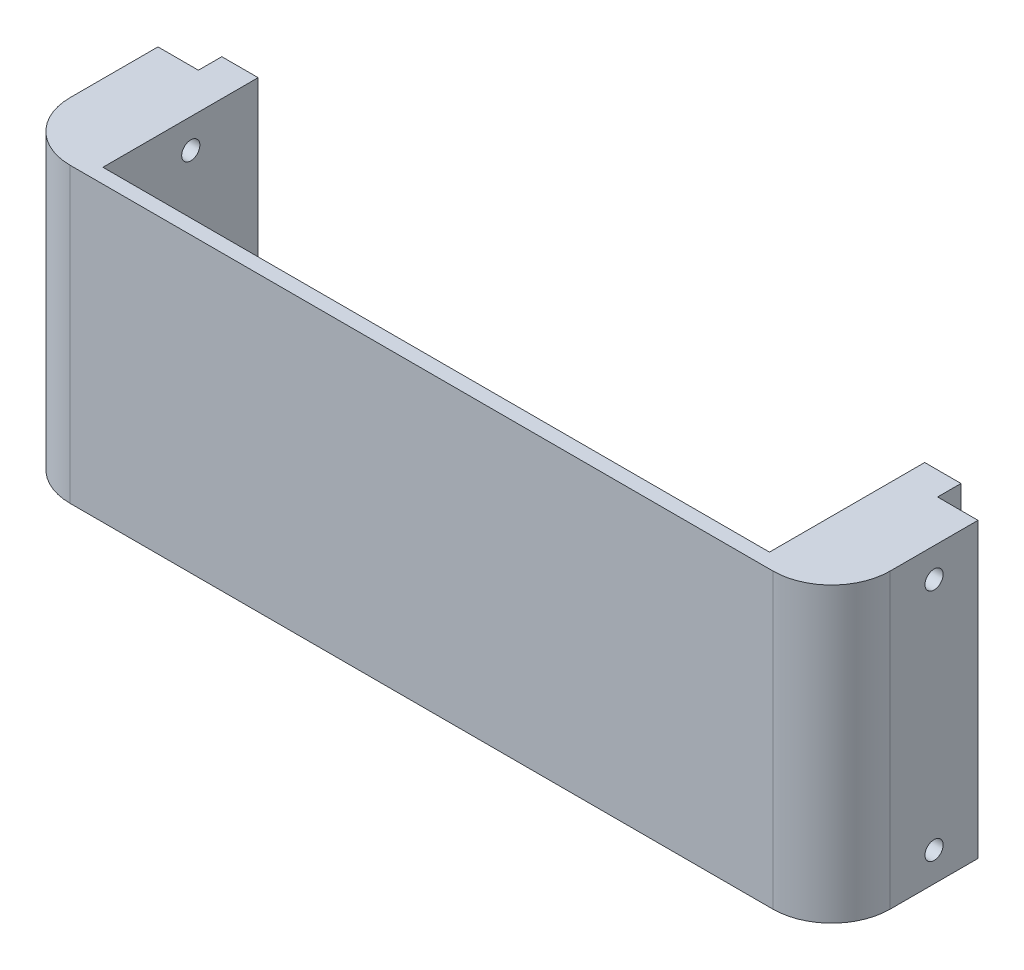
ISO-10303-21;
HEADER;
FILE_DESCRIPTION(('STEP AP214'),'2;1');
FILE_NAME('part.step','',(''),(''),'','','');
FILE_SCHEMA(('AUTOMOTIVE_DESIGN { 1 0 10303 214 1 1 1 1 }'));
ENDSEC;
DATA;
#1=APPLICATION_CONTEXT('core data for automotive mechanical design processes');
#2=APPLICATION_PROTOCOL_DEFINITION('international standard','automotive_design',2000,#1);
#3=PRODUCT_CONTEXT('',#1,'mechanical');
#4=PRODUCT('Part','Part','',(#3));
#5=PRODUCT_RELATED_PRODUCT_CATEGORY('part','',(#4));
#6=PRODUCT_DEFINITION_FORMATION('','',#4);
#7=PRODUCT_DEFINITION_CONTEXT('part definition',#1,'design');
#8=PRODUCT_DEFINITION('design','',#6,#7);
#9=PRODUCT_DEFINITION_SHAPE('','',#8);
#10=(LENGTH_UNIT() NAMED_UNIT(*) SI_UNIT(.MILLI.,.METRE.));
#11=(NAMED_UNIT(*) PLANE_ANGLE_UNIT() SI_UNIT($,.RADIAN.));
#12=(NAMED_UNIT(*) SI_UNIT($,.STERADIAN.) SOLID_ANGLE_UNIT());
#13=UNCERTAINTY_MEASURE_WITH_UNIT(LENGTH_MEASURE(1.E-05),#10,'distance_accuracy_value','');
#14=(GEOMETRIC_REPRESENTATION_CONTEXT(3) GLOBAL_UNCERTAINTY_ASSIGNED_CONTEXT((#13)) GLOBAL_UNIT_ASSIGNED_CONTEXT((#10,
#11,#12)) REPRESENTATION_CONTEXT('',''));
#15=CARTESIAN_POINT('',(0.,0.,0.));
#16=DIRECTION('',(0.,0.,1.));
#17=DIRECTION('',(1.,0.,0.));
#18=AXIS2_PLACEMENT_3D('',#15,#16,#17);
#19=CARTESIAN_POINT('',(0.,22.,14.));
#20=DIRECTION('',(0.,1.,0.));
#21=DIRECTION('',(0.,0.,1.));
#22=AXIS2_PLACEMENT_3D('',#19,#20,#21);
#23=PLANE('',#22);
#24=DIRECTION('',(1.,0.,0.));
#25=VECTOR('',#24,1.);
#26=CARTESIAN_POINT('',(9.99999999999999,22.,26.5));
#27=LINE('',#26,#25);
#28=CARTESIAN_POINT('',(3.1,22.,26.5));
#29=VERTEX_POINT('',#28);
#30=CARTESIAN_POINT('',(116.9,22.,26.5));
#31=VERTEX_POINT('',#30);
#32=EDGE_CURVE('E281',#29,#31,#27,.T.);
#33=ORIENTED_EDGE('',*,*,#32,.F.);
#34=DIRECTION('',(0.,0.,-1.));
#35=VECTOR('',#34,1.);
#36=CARTESIAN_POINT('',(3.1,22.,0.));
#37=LINE('',#36,#35);
#38=CARTESIAN_POINT('',(3.1,22.,0.));
#39=VERTEX_POINT('',#38);
#40=EDGE_CURVE('E306',#29,#39,#37,.T.);
#41=ORIENTED_EDGE('',*,*,#40,.T.);
#42=DIRECTION('',(1.,0.,0.));
#43=VECTOR('',#42,1.);
#44=CARTESIAN_POINT('',(0.,22.,0.));
#45=LINE('',#44,#43);
#46=CARTESIAN_POINT('',(-3.1,22.,0.));
#47=VERTEX_POINT('',#46);
#48=EDGE_CURVE('E12',#47,#39,#45,.T.);
#49=ORIENTED_EDGE('',*,*,#48,.F.);
#50=DIRECTION('',(0.,0.,1.));
#51=VECTOR('',#50,1.);
#52=CARTESIAN_POINT('',(-3.1,22.,0.));
#53=LINE('',#52,#51);
#54=CARTESIAN_POINT('',(-3.1,22.,4.));
#55=VERTEX_POINT('',#54);
#56=EDGE_CURVE('E302',#47,#55,#53,.T.);
#57=ORIENTED_EDGE('',*,*,#56,.T.);
#58=DIRECTION('',(-1.,0.,0.));
#59=VECTOR('',#58,1.);
#60=CARTESIAN_POINT('',(0.,22.,4.));
#61=LINE('',#60,#59);
#62=CARTESIAN_POINT('',(-10.,22.,4.));
#63=VERTEX_POINT('',#62);
#64=EDGE_CURVE('E305',#55,#63,#61,.T.);
#65=ORIENTED_EDGE('',*,*,#64,.T.);
#66=DIRECTION('',(0.,0.,-1.));
#67=VECTOR('',#66,1.);
#68=CARTESIAN_POINT('',(-10.,22.,14.));
#69=LINE('',#68,#67);
#70=CARTESIAN_POINT('',(-10.,22.,19.));
#71=VERTEX_POINT('',#70);
#72=EDGE_CURVE('E300',#71,#63,#69,.T.);
#73=ORIENTED_EDGE('',*,*,#72,.F.);
#74=CARTESIAN_POINT('',(0.,22.,19.));
#75=DIRECTION('',(0.,1.,0.));
#76=DIRECTION('',(-1.,0.,0.));
#77=AXIS2_PLACEMENT_3D('',#74,#75,#76);
#78=CIRCLE('',#77,10.);
#79=CARTESIAN_POINT('',(0.,22.,29.));
#80=VERTEX_POINT('',#79);
#81=EDGE_CURVE('E296',#71,#80,#78,.T.);
#82=ORIENTED_EDGE('',*,*,#81,.T.);
#83=DIRECTION('',(1.,0.,0.));
#84=VECTOR('',#83,1.);
#85=CARTESIAN_POINT('',(-10.,22.,29.));
#86=LINE('',#85,#84);
#87=CARTESIAN_POINT('',(120.,22.,29.));
#88=VERTEX_POINT('',#87);
#89=EDGE_CURVE('E205',#80,#88,#86,.T.);
#90=ORIENTED_EDGE('',*,*,#89,.T.);
#91=CARTESIAN_POINT('',(120.,22.,19.));
#92=DIRECTION('',(0.,-1.,0.));
#93=DIRECTION('',(1.,0.,0.));
#94=AXIS2_PLACEMENT_3D('',#91,#92,#93);
#95=CIRCLE('',#94,10.);
#96=CARTESIAN_POINT('',(130.,22.,19.));
#97=VERTEX_POINT('',#96);
#98=EDGE_CURVE('E262',#97,#88,#95,.T.);
#99=ORIENTED_EDGE('',*,*,#98,.F.);
#100=DIRECTION('',(0.,0.,-1.));
#101=VECTOR('',#100,1.);
#102=CARTESIAN_POINT('',(130.,22.,19.));
#103=LINE('',#102,#101);
#104=CARTESIAN_POINT('',(130.,22.,4.));
#105=VERTEX_POINT('',#104);
#106=EDGE_CURVE('E267',#97,#105,#103,.T.);
#107=ORIENTED_EDGE('',*,*,#106,.T.);
#108=DIRECTION('',(1.,0.,0.));
#109=VECTOR('',#108,1.);
#110=CARTESIAN_POINT('',(123.1,22.,4.));
#111=LINE('',#110,#109);
#112=CARTESIAN_POINT('',(123.1,22.,4.));
#113=VERTEX_POINT('',#112);
#114=EDGE_CURVE('E269',#113,#105,#111,.T.);
#115=ORIENTED_EDGE('',*,*,#114,.F.);
#116=DIRECTION('',(0.,0.,1.));
#117=VECTOR('',#116,1.);
#118=CARTESIAN_POINT('',(123.1,22.,0.));
#119=LINE('',#118,#117);
#120=CARTESIAN_POINT('',(123.1,22.,0.));
#121=VERTEX_POINT('',#120);
#122=EDGE_CURVE('E272',#121,#113,#119,.T.);
#123=ORIENTED_EDGE('',*,*,#122,.F.);
#124=DIRECTION('',(1.,0.,0.));
#125=VECTOR('',#124,1.);
#126=CARTESIAN_POINT('',(120.,22.,0.));
#127=LINE('',#126,#125);
#128=CARTESIAN_POINT('',(116.9,22.,0.));
#129=VERTEX_POINT('',#128);
#130=EDGE_CURVE('E275',#129,#121,#127,.T.);
#131=ORIENTED_EDGE('',*,*,#130,.F.);
#132=DIRECTION('',(0.,0.,-1.));
#133=VECTOR('',#132,1.);
#134=CARTESIAN_POINT('',(116.9,22.,4.));
#135=LINE('',#134,#133);
#136=EDGE_CURVE('E278',#31,#129,#135,.T.);
#137=ORIENTED_EDGE('',*,*,#136,.F.);
#138=EDGE_LOOP('',(#33,#41,#49,#57,#65,#73,#82,#90,#99,#107,#115,#123,#131,#137));
#139=FACE_BOUND('',#138,.T.);
#140=ADVANCED_FACE('F92',(#139),#23,.T.);
#141=CARTESIAN_POINT('',(-10.,22.,29.));
#142=DIRECTION('',(0.,0.,-1.));
#143=DIRECTION('',(-1.,0.,0.));
#144=AXIS2_PLACEMENT_3D('',#141,#142,#143);
#145=PLANE('',#144);
#146=DIRECTION('',(0.,-1.,0.));
#147=VECTOR('',#146,1.);
#148=CARTESIAN_POINT('',(0.,22.,29.));
#149=LINE('',#148,#147);
#150=CARTESIAN_POINT('',(0.,-28.,29.));
#151=VERTEX_POINT('',#150);
#152=EDGE_CURVE('E134',#80,#151,#149,.T.);
#153=ORIENTED_EDGE('',*,*,#152,.T.);
#154=DIRECTION('',(1.,0.,0.));
#155=VECTOR('',#154,1.);
#156=CARTESIAN_POINT('',(0.,-28.,29.));
#157=LINE('',#156,#155);
#158=CARTESIAN_POINT('',(120.,-28.,29.));
#159=VERTEX_POINT('',#158);
#160=EDGE_CURVE('E204',#151,#159,#157,.T.);
#161=ORIENTED_EDGE('',*,*,#160,.T.);
#162=DIRECTION('',(0.,-1.,0.));
#163=VECTOR('',#162,1.);
#164=CARTESIAN_POINT('',(120.,22.,29.));
#165=LINE('',#164,#163);
#166=EDGE_CURVE('E294',#88,#159,#165,.T.);
#167=ORIENTED_EDGE('',*,*,#166,.F.);
#168=ORIENTED_EDGE('',*,*,#89,.F.);
#169=EDGE_LOOP('',(#153,#161,#167,#168));
#170=FACE_BOUND('',#169,.T.);
#171=ADVANCED_FACE('F202',(#170),#145,.F.);
#172=CARTESIAN_POINT('',(0.,-22.,4.));
#173=DIRECTION('',(0.,0.,-1.));
#174=DIRECTION('',(-1.,0.,0.));
#175=AXIS2_PLACEMENT_3D('',#172,#173,#174);
#176=PLANE('',#175);
#177=ORIENTED_EDGE('',*,*,#64,.F.);
#178=DIRECTION('',(0.,1.,0.));
#179=VECTOR('',#178,1.);
#180=CARTESIAN_POINT('',(-3.1,-22.,4.));
#181=LINE('',#180,#179);
#182=CARTESIAN_POINT('',(-3.1,-28.,4.));
#183=VERTEX_POINT('',#182);
#184=EDGE_CURVE('E100',#183,#55,#181,.T.);
#185=ORIENTED_EDGE('',*,*,#184,.F.);
#186=DIRECTION('',(-1.,0.,0.));
#187=VECTOR('',#186,1.);
#188=CARTESIAN_POINT('',(-3.1,-28.,4.));
#189=LINE('',#188,#187);
#190=CARTESIAN_POINT('',(-10.,-28.,4.));
#191=VERTEX_POINT('',#190);
#192=EDGE_CURVE('E253',#183,#191,#189,.T.);
#193=ORIENTED_EDGE('',*,*,#192,.T.);
#194=DIRECTION('',(0.,1.,0.));
#195=VECTOR('',#194,1.);
#196=CARTESIAN_POINT('',(-10.,-22.,4.));
#197=LINE('',#196,#195);
#198=EDGE_CURVE('E310',#191,#63,#197,.T.);
#199=ORIENTED_EDGE('',*,*,#198,.T.);
#200=EDGE_LOOP('',(#177,#185,#193,#199));
#201=FACE_BOUND('',#200,.T.);
#202=ADVANCED_FACE('F395',(#201),#176,.T.);
#203=CARTESIAN_POINT('',(0.,0.,0.));
#204=DIRECTION('',(0.,0.,1.));
#205=DIRECTION('',(1.,0.,0.));
#206=AXIS2_PLACEMENT_3D('',#203,#204,#205);
#207=PLANE('',#206);
#208=DIRECTION('',(0.,1.,0.));
#209=VECTOR('',#208,1.);
#210=CARTESIAN_POINT('',(-3.1,-22.,0.));
#211=LINE('',#210,#209);
#212=CARTESIAN_POINT('',(-3.1,-28.,0.));
#213=VERTEX_POINT('',#212);
#214=EDGE_CURVE('E107',#213,#47,#211,.T.);
#215=ORIENTED_EDGE('',*,*,#214,.T.);
#216=ORIENTED_EDGE('',*,*,#48,.T.);
#217=DIRECTION('',(0.,1.,0.));
#218=VECTOR('',#217,1.);
#219=CARTESIAN_POINT('',(3.1,-22.,0.));
#220=LINE('',#219,#218);
#221=CARTESIAN_POINT('',(3.1,-28.,0.));
#222=VERTEX_POINT('',#221);
#223=EDGE_CURVE('E126',#222,#39,#220,.T.);
#224=ORIENTED_EDGE('',*,*,#223,.F.);
#225=DIRECTION('',(-1.,0.,0.));
#226=VECTOR('',#225,1.);
#227=CARTESIAN_POINT('',(3.1,-28.,0.));
#228=LINE('',#227,#226);
#229=EDGE_CURVE('E249',#222,#213,#228,.T.);
#230=ORIENTED_EDGE('',*,*,#229,.T.);
#231=EDGE_LOOP('',(#215,#216,#224,#230));
#232=FACE_BOUND('',#231,.T.);
#233=ADVANCED_FACE('F381',(#232),#207,.F.);
#234=CARTESIAN_POINT('',(3.1,-22.,0.));
#235=DIRECTION('',(1.,0.,0.));
#236=DIRECTION('',(0.,0.,-1.));
#237=AXIS2_PLACEMENT_3D('',#234,#235,#236);
#238=PLANE('',#237);
#239=CARTESIAN_POINT('',(3.1000000000001,17.,11.5));
#240=DIRECTION('',(1.,0.,0.));
#241=DIRECTION('',(0.,0.,-1.));
#242=AXIS2_PLACEMENT_3D('',#239,#240,#241);
#243=CIRCLE('',#242,1.55);
#244=CARTESIAN_POINT('',(3.1000000000001,17.,9.95));
#245=VERTEX_POINT('',#244);
#246=EDGE_CURVE('E221',#245,#245,#243,.T.);
#247=ORIENTED_EDGE('',*,*,#246,.F.);
#248=EDGE_LOOP('',(#247));
#249=FACE_BOUND('',#248,.T.);
#250=CARTESIAN_POINT('',(3.1000000000001,-23.,11.5));
#251=DIRECTION('',(1.,0.,0.));
#252=DIRECTION('',(0.,0.,-1.));
#253=AXIS2_PLACEMENT_3D('',#250,#251,#252);
#254=CIRCLE('',#253,1.55);
#255=CARTESIAN_POINT('',(3.1000000000001,-23.,9.95));
#256=VERTEX_POINT('',#255);
#257=EDGE_CURVE('E322',#256,#256,#254,.T.);
#258=ORIENTED_EDGE('',*,*,#257,.F.);
#259=EDGE_LOOP('',(#258));
#260=FACE_BOUND('',#259,.T.);
#261=ORIENTED_EDGE('',*,*,#223,.T.);
#262=ORIENTED_EDGE('',*,*,#40,.F.);
#263=DIRECTION('',(0.,1.,0.));
#264=VECTOR('',#263,1.);
#265=CARTESIAN_POINT('',(3.1,-28.,26.5));
#266=LINE('',#265,#264);
#267=CARTESIAN_POINT('',(3.1,-28.,26.5));
#268=VERTEX_POINT('',#267);
#269=EDGE_CURVE('E259',#268,#29,#266,.T.);
#270=ORIENTED_EDGE('',*,*,#269,.F.);
#271=DIRECTION('',(0.,0.,-1.));
#272=VECTOR('',#271,1.);
#273=CARTESIAN_POINT('',(3.1,-28.,26.5));
#274=LINE('',#273,#272);
#275=EDGE_CURVE('E247',#268,#222,#274,.T.);
#276=ORIENTED_EDGE('',*,*,#275,.T.);
#277=EDGE_LOOP('',(#261,#262,#270,#276));
#278=FACE_BOUND('',#277,.T.);
#279=ADVANCED_FACE('F382',(#249,#260,#278),#238,.T.);
#280=CARTESIAN_POINT('',(-3.1,-22.,0.));
#281=DIRECTION('',(-1.,0.,0.));
#282=DIRECTION('',(0.,0.,1.));
#283=AXIS2_PLACEMENT_3D('',#280,#281,#282);
#284=PLANE('',#283);
#285=ORIENTED_EDGE('',*,*,#184,.T.);
#286=ORIENTED_EDGE('',*,*,#56,.F.);
#287=ORIENTED_EDGE('',*,*,#214,.F.);
#288=DIRECTION('',(0.,0.,1.));
#289=VECTOR('',#288,1.);
#290=CARTESIAN_POINT('',(-3.1,-28.,0.));
#291=LINE('',#290,#289);
#292=EDGE_CURVE('E251',#213,#183,#291,.T.);
#293=ORIENTED_EDGE('',*,*,#292,.T.);
#294=EDGE_LOOP('',(#285,#286,#287,#293));
#295=FACE_BOUND('',#294,.T.);
#296=ADVANCED_FACE('F379',(#295),#284,.T.);
#297=CARTESIAN_POINT('',(-10.,28.,0.));
#298=DIRECTION('',(1.,0.,0.));
#299=DIRECTION('',(0.,1.,0.));
#300=AXIS2_PLACEMENT_3D('',#297,#298,#299);
#301=PLANE('',#300);
#302=CARTESIAN_POINT('',(-10.,17.,11.5));
#303=DIRECTION('',(-1.,0.,0.));
#304=DIRECTION('',(0.,-1.,0.));
#305=AXIS2_PLACEMENT_3D('',#302,#303,#304);
#306=CIRCLE('',#305,1.55);
#307=CARTESIAN_POINT('',(-10.,15.45,11.5));
#308=VERTEX_POINT('',#307);
#309=EDGE_CURVE('E318',#308,#308,#306,.T.);
#310=ORIENTED_EDGE('',*,*,#309,.F.);
#311=EDGE_LOOP('',(#310));
#312=FACE_BOUND('',#311,.T.);
#313=CARTESIAN_POINT('',(-10.,-23.,11.5));
#314=DIRECTION('',(-1.,0.,0.));
#315=DIRECTION('',(0.,-1.,0.));
#316=AXIS2_PLACEMENT_3D('',#313,#314,#315);
#317=CIRCLE('',#316,1.55);
#318=CARTESIAN_POINT('',(-10.,-24.55,11.5));
#319=VERTEX_POINT('',#318);
#320=EDGE_CURVE('E325',#319,#319,#317,.T.);
#321=ORIENTED_EDGE('',*,*,#320,.F.);
#322=EDGE_LOOP('',(#321));
#323=FACE_BOUND('',#322,.T.);
#324=ORIENTED_EDGE('',*,*,#198,.F.);
#325=DIRECTION('',(0.,0.,1.));
#326=VECTOR('',#325,1.);
#327=CARTESIAN_POINT('',(-10.,-28.,4.));
#328=LINE('',#327,#326);
#329=CARTESIAN_POINT('',(-10.,-28.,19.));
#330=VERTEX_POINT('',#329);
#331=EDGE_CURVE('E256',#191,#330,#328,.T.);
#332=ORIENTED_EDGE('',*,*,#331,.T.);
#333=DIRECTION('',(0.,-1.,0.));
#334=VECTOR('',#333,1.);
#335=CARTESIAN_POINT('',(-10.,22.,19.));
#336=LINE('',#335,#334);
#337=EDGE_CURVE('E206',#71,#330,#336,.T.);
#338=ORIENTED_EDGE('',*,*,#337,.F.);
#339=ORIENTED_EDGE('',*,*,#72,.T.);
#340=EDGE_LOOP('',(#324,#332,#338,#339));
#341=FACE_BOUND('',#340,.T.);
#342=ADVANCED_FACE('F374',(#312,#323,#341),#301,.F.);
#343=CARTESIAN_POINT('',(0.,22.,19.));
#344=DIRECTION('',(0.,-1.,0.));
#345=DIRECTION('',(1.,0.,0.));
#346=AXIS2_PLACEMENT_3D('',#343,#344,#345);
#347=CYLINDRICAL_SURFACE('',#346,10.);
#348=ORIENTED_EDGE('',*,*,#337,.T.);
#349=CARTESIAN_POINT('',(0.,-28.,19.));
#350=DIRECTION('',(0.,1.,0.));
#351=DIRECTION('',(-1.,0.,0.));
#352=AXIS2_PLACEMENT_3D('',#349,#350,#351);
#353=CIRCLE('',#352,10.);
#354=EDGE_CURVE('E213',#330,#151,#353,.T.);
#355=ORIENTED_EDGE('',*,*,#354,.T.);
#356=ORIENTED_EDGE('',*,*,#152,.F.);
#357=ORIENTED_EDGE('',*,*,#81,.F.);
#358=EDGE_LOOP('',(#348,#355,#356,#357));
#359=FACE_BOUND('',#358,.T.);
#360=ADVANCED_FACE('F219',(#359),#347,.T.);
#361=CARTESIAN_POINT('',(120.,22.,19.));
#362=DIRECTION('',(0.,-1.,0.));
#363=DIRECTION('',(1.,0.,0.));
#364=AXIS2_PLACEMENT_3D('',#361,#362,#363);
#365=CYLINDRICAL_SURFACE('',#364,10.);
#366=ORIENTED_EDGE('',*,*,#166,.T.);
#367=CARTESIAN_POINT('',(120.,-28.,19.));
#368=DIRECTION('',(0.,-1.,0.));
#369=DIRECTION('',(1.,0.,0.));
#370=AXIS2_PLACEMENT_3D('',#367,#368,#369);
#371=CIRCLE('',#370,10.);
#372=CARTESIAN_POINT('',(130.,-28.,19.));
#373=VERTEX_POINT('',#372);
#374=EDGE_CURVE('E217',#373,#159,#371,.T.);
#375=ORIENTED_EDGE('',*,*,#374,.F.);
#376=DIRECTION('',(0.,-1.,0.));
#377=VECTOR('',#376,1.);
#378=CARTESIAN_POINT('',(130.,22.,19.));
#379=LINE('',#378,#377);
#380=EDGE_CURVE('E292',#97,#373,#379,.T.);
#381=ORIENTED_EDGE('',*,*,#380,.F.);
#382=ORIENTED_EDGE('',*,*,#98,.T.);
#383=EDGE_LOOP('',(#366,#375,#381,#382));
#384=FACE_BOUND('',#383,.T.);
#385=ADVANCED_FACE('F371',(#384),#365,.T.);
#386=CARTESIAN_POINT('',(130.,22.,19.));
#387=DIRECTION('',(-1.,0.,0.));
#388=DIRECTION('',(0.,-1.,0.));
#389=AXIS2_PLACEMENT_3D('',#386,#387,#388);
#390=PLANE('',#389);
#391=CARTESIAN_POINT('',(130.,17.,11.5));
#392=DIRECTION('',(-1.,0.,0.));
#393=DIRECTION('',(0.,-1.,0.));
#394=AXIS2_PLACEMENT_3D('',#391,#392,#393);
#395=CIRCLE('',#394,1.55);
#396=CARTESIAN_POINT('',(130.,15.45,11.5));
#397=VERTEX_POINT('',#396);
#398=EDGE_CURVE('E224',#397,#397,#395,.T.);
#399=ORIENTED_EDGE('',*,*,#398,.T.);
#400=EDGE_LOOP('',(#399));
#401=FACE_BOUND('',#400,.T.);
#402=CARTESIAN_POINT('',(130.,-23.,11.5));
#403=DIRECTION('',(-1.,0.,0.));
#404=DIRECTION('',(0.,-1.,0.));
#405=AXIS2_PLACEMENT_3D('',#402,#403,#404);
#406=CIRCLE('',#405,1.55);
#407=CARTESIAN_POINT('',(130.,-24.55,11.5));
#408=VERTEX_POINT('',#407);
#409=EDGE_CURVE('E317',#408,#408,#406,.T.);
#410=ORIENTED_EDGE('',*,*,#409,.T.);
#411=EDGE_LOOP('',(#410));
#412=FACE_BOUND('',#411,.T.);
#413=ORIENTED_EDGE('',*,*,#380,.T.);
#414=DIRECTION('',(0.,0.,-1.));
#415=VECTOR('',#414,1.);
#416=CARTESIAN_POINT('',(130.,-28.,19.));
#417=LINE('',#416,#415);
#418=CARTESIAN_POINT('',(130.,-28.,4.));
#419=VERTEX_POINT('',#418);
#420=EDGE_CURVE('E229',#373,#419,#417,.T.);
#421=ORIENTED_EDGE('',*,*,#420,.T.);
#422=DIRECTION('',(0.,-1.,0.));
#423=VECTOR('',#422,1.);
#424=CARTESIAN_POINT('',(130.,22.,4.));
#425=LINE('',#424,#423);
#426=EDGE_CURVE('E290',#105,#419,#425,.T.);
#427=ORIENTED_EDGE('',*,*,#426,.F.);
#428=ORIENTED_EDGE('',*,*,#106,.F.);
#429=EDGE_LOOP('',(#413,#421,#427,#428));
#430=FACE_BOUND('',#429,.T.);
#431=ADVANCED_FACE('F369',(#401,#412,#430),#390,.F.);
#432=CARTESIAN_POINT('',(123.1,22.,4.));
#433=DIRECTION('',(0.,0.,-1.));
#434=DIRECTION('',(-1.,0.,0.));
#435=AXIS2_PLACEMENT_3D('',#432,#433,#434);
#436=PLANE('',#435);
#437=ORIENTED_EDGE('',*,*,#426,.T.);
#438=DIRECTION('',(-1.,0.,0.));
#439=VECTOR('',#438,1.);
#440=CARTESIAN_POINT('',(130.,-28.,4.));
#441=LINE('',#440,#439);
#442=CARTESIAN_POINT('',(123.1,-28.,4.));
#443=VERTEX_POINT('',#442);
#444=EDGE_CURVE('E232',#419,#443,#441,.T.);
#445=ORIENTED_EDGE('',*,*,#444,.T.);
#446=DIRECTION('',(0.,-1.,0.));
#447=VECTOR('',#446,1.);
#448=CARTESIAN_POINT('',(123.1,22.,4.));
#449=LINE('',#448,#447);
#450=EDGE_CURVE('E288',#113,#443,#449,.T.);
#451=ORIENTED_EDGE('',*,*,#450,.F.);
#452=ORIENTED_EDGE('',*,*,#114,.T.);
#453=EDGE_LOOP('',(#437,#445,#451,#452));
#454=FACE_BOUND('',#453,.T.);
#455=ADVANCED_FACE('F366',(#454),#436,.T.);
#456=CARTESIAN_POINT('',(123.1,22.,0.));
#457=DIRECTION('',(1.,0.,0.));
#458=DIRECTION('',(0.,1.,0.));
#459=AXIS2_PLACEMENT_3D('',#456,#457,#458);
#460=PLANE('',#459);
#461=ORIENTED_EDGE('',*,*,#450,.T.);
#462=DIRECTION('',(0.,0.,-1.));
#463=VECTOR('',#462,1.);
#464=CARTESIAN_POINT('',(123.1,-28.,4.));
#465=LINE('',#464,#463);
#466=CARTESIAN_POINT('',(123.1,-28.,0.));
#467=VERTEX_POINT('',#466);
#468=EDGE_CURVE('E235',#443,#467,#465,.T.);
#469=ORIENTED_EDGE('',*,*,#468,.T.);
#470=DIRECTION('',(0.,-1.,0.));
#471=VECTOR('',#470,1.);
#472=CARTESIAN_POINT('',(123.1,22.,0.));
#473=LINE('',#472,#471);
#474=EDGE_CURVE('E286',#121,#467,#473,.T.);
#475=ORIENTED_EDGE('',*,*,#474,.F.);
#476=ORIENTED_EDGE('',*,*,#122,.T.);
#477=EDGE_LOOP('',(#461,#469,#475,#476));
#478=FACE_BOUND('',#477,.T.);
#479=ADVANCED_FACE('F358',(#478),#460,.T.);
#480=CARTESIAN_POINT('',(116.9,22.,0.));
#481=DIRECTION('',(0.,0.,-1.));
#482=DIRECTION('',(-1.,0.,0.));
#483=AXIS2_PLACEMENT_3D('',#480,#481,#482);
#484=PLANE('',#483);
#485=ORIENTED_EDGE('',*,*,#474,.T.);
#486=DIRECTION('',(-1.,0.,0.));
#487=VECTOR('',#486,1.);
#488=CARTESIAN_POINT('',(123.1,-28.,0.));
#489=LINE('',#488,#487);
#490=CARTESIAN_POINT('',(116.9,-28.,0.));
#491=VERTEX_POINT('',#490);
#492=EDGE_CURVE('E238',#467,#491,#489,.T.);
#493=ORIENTED_EDGE('',*,*,#492,.T.);
#494=DIRECTION('',(0.,-1.,0.));
#495=VECTOR('',#494,1.);
#496=CARTESIAN_POINT('',(116.9,22.,0.));
#497=LINE('',#496,#495);
#498=EDGE_CURVE('E284',#129,#491,#497,.T.);
#499=ORIENTED_EDGE('',*,*,#498,.F.);
#500=ORIENTED_EDGE('',*,*,#130,.T.);
#501=EDGE_LOOP('',(#485,#493,#499,#500));
#502=FACE_BOUND('',#501,.T.);
#503=ADVANCED_FACE('F346',(#502),#484,.T.);
#504=CARTESIAN_POINT('',(116.9,22.,4.));
#505=DIRECTION('',(-1.,0.,0.));
#506=DIRECTION('',(0.,-1.,0.));
#507=AXIS2_PLACEMENT_3D('',#504,#505,#506);
#508=PLANE('',#507);
#509=CARTESIAN_POINT('',(116.9,17.,11.5));
#510=DIRECTION('',(-1.,0.,0.));
#511=DIRECTION('',(0.,-1.,0.));
#512=AXIS2_PLACEMENT_3D('',#509,#510,#511);
#513=CIRCLE('',#512,1.55);
#514=CARTESIAN_POINT('',(116.9,15.45,11.5));
#515=VERTEX_POINT('',#514);
#516=EDGE_CURVE('E95',#515,#515,#513,.T.);
#517=ORIENTED_EDGE('',*,*,#516,.F.);
#518=EDGE_LOOP('',(#517));
#519=FACE_BOUND('',#518,.T.);
#520=CARTESIAN_POINT('',(116.9,-23.,11.5));
#521=DIRECTION('',(-1.,0.,0.));
#522=DIRECTION('',(0.,-1.,0.));
#523=AXIS2_PLACEMENT_3D('',#520,#521,#522);
#524=CIRCLE('',#523,1.55);
#525=CARTESIAN_POINT('',(116.9,-24.55,11.5));
#526=VERTEX_POINT('',#525);
#527=EDGE_CURVE('E315',#526,#526,#524,.T.);
#528=ORIENTED_EDGE('',*,*,#527,.F.);
#529=EDGE_LOOP('',(#528));
#530=FACE_BOUND('',#529,.T.);
#531=ORIENTED_EDGE('',*,*,#498,.T.);
#532=DIRECTION('',(0.,0.,1.));
#533=VECTOR('',#532,1.);
#534=CARTESIAN_POINT('',(116.9,-28.,0.));
#535=LINE('',#534,#533);
#536=CARTESIAN_POINT('',(116.9,-28.,26.5));
#537=VERTEX_POINT('',#536);
#538=EDGE_CURVE('E241',#491,#537,#535,.T.);
#539=ORIENTED_EDGE('',*,*,#538,.T.);
#540=DIRECTION('',(0.,1.,0.));
#541=VECTOR('',#540,1.);
#542=CARTESIAN_POINT('',(116.9,-28.,26.5));
#543=LINE('',#542,#541);
#544=EDGE_CURVE('E258',#537,#31,#543,.T.);
#545=ORIENTED_EDGE('',*,*,#544,.T.);
#546=ORIENTED_EDGE('',*,*,#136,.T.);
#547=EDGE_LOOP('',(#531,#539,#545,#546));
#548=FACE_BOUND('',#547,.T.);
#549=ADVANCED_FACE('F342',(#519,#530,#548),#508,.T.);
#550=CARTESIAN_POINT('',(9.99999999999999,22.,26.5));
#551=DIRECTION('',(0.,0.,-1.));
#552=DIRECTION('',(-1.,0.,0.));
#553=AXIS2_PLACEMENT_3D('',#550,#551,#552);
#554=PLANE('',#553);
#555=ORIENTED_EDGE('',*,*,#544,.F.);
#556=DIRECTION('',(-1.,0.,0.));
#557=VECTOR('',#556,1.);
#558=CARTESIAN_POINT('',(116.9,-28.,26.5));
#559=LINE('',#558,#557);
#560=EDGE_CURVE('E244',#537,#268,#559,.T.);
#561=ORIENTED_EDGE('',*,*,#560,.T.);
#562=ORIENTED_EDGE('',*,*,#269,.T.);
#563=ORIENTED_EDGE('',*,*,#32,.T.);
#564=EDGE_LOOP('',(#555,#561,#562,#563));
#565=FACE_BOUND('',#564,.T.);
#566=ADVANCED_FACE('F345',(#565),#554,.T.);
#567=CARTESIAN_POINT('',(0.,-28.,19.));
#568=DIRECTION('',(0.,1.,0.));
#569=DIRECTION('',(-1.,0.,0.));
#570=AXIS2_PLACEMENT_3D('',#567,#568,#569);
#571=PLANE('',#570);
#572=ORIENTED_EDGE('',*,*,#354,.F.);
#573=ORIENTED_EDGE('',*,*,#331,.F.);
#574=ORIENTED_EDGE('',*,*,#192,.F.);
#575=ORIENTED_EDGE('',*,*,#292,.F.);
#576=ORIENTED_EDGE('',*,*,#229,.F.);
#577=ORIENTED_EDGE('',*,*,#275,.F.);
#578=ORIENTED_EDGE('',*,*,#560,.F.);
#579=ORIENTED_EDGE('',*,*,#538,.F.);
#580=ORIENTED_EDGE('',*,*,#492,.F.);
#581=ORIENTED_EDGE('',*,*,#468,.F.);
#582=ORIENTED_EDGE('',*,*,#444,.F.);
#583=ORIENTED_EDGE('',*,*,#420,.F.);
#584=ORIENTED_EDGE('',*,*,#374,.T.);
#585=ORIENTED_EDGE('',*,*,#160,.F.);
#586=EDGE_LOOP('',(#572,#573,#574,#575,#576,#577,#578,#579,#580,#581,#582,#583,#584,#585));
#587=FACE_BOUND('',#586,.T.);
#588=ADVANCED_FACE('F211',(#587),#571,.F.);
#589=CARTESIAN_POINT('',(1990.,-22.9999999999998,11.5));
#590=DIRECTION('',(-1.,0.,0.));
#591=DIRECTION('',(0.,-1.,0.));
#592=AXIS2_PLACEMENT_3D('',#589,#590,#591);
#593=CYLINDRICAL_SURFACE('',#592,1.55);
#594=ORIENTED_EDGE('',*,*,#527,.T.);
#595=EDGE_LOOP('',(#594));
#596=FACE_BOUND('',#595,.T.);
#597=ORIENTED_EDGE('',*,*,#409,.F.);
#598=EDGE_LOOP('',(#597));
#599=FACE_BOUND('',#598,.T.);
#600=ADVANCED_FACE('F389',(#596,#599),#593,.F.);
#601=CARTESIAN_POINT('',(1990.,17.0000000000002,11.5));
#602=DIRECTION('',(-1.,0.,0.));
#603=DIRECTION('',(0.,-1.,0.));
#604=AXIS2_PLACEMENT_3D('',#601,#602,#603);
#605=CYLINDRICAL_SURFACE('',#604,1.55);
#606=ORIENTED_EDGE('',*,*,#516,.T.);
#607=EDGE_LOOP('',(#606));
#608=FACE_BOUND('',#607,.T.);
#609=ORIENTED_EDGE('',*,*,#398,.F.);
#610=EDGE_LOOP('',(#609));
#611=FACE_BOUND('',#610,.T.);
#612=ADVANCED_FACE('F339',(#608,#611),#605,.F.);
#613=ORIENTED_EDGE('',*,*,#257,.T.);
#614=EDGE_LOOP('',(#613));
#615=FACE_BOUND('',#614,.T.);
#616=ORIENTED_EDGE('',*,*,#320,.T.);
#617=EDGE_LOOP('',(#616));
#618=FACE_BOUND('',#617,.T.);
#619=ADVANCED_FACE('F479',(#615,#618),#593,.F.);
#620=ORIENTED_EDGE('',*,*,#246,.T.);
#621=EDGE_LOOP('',(#620));
#622=FACE_BOUND('',#621,.T.);
#623=ORIENTED_EDGE('',*,*,#309,.T.);
#624=EDGE_LOOP('',(#623));
#625=FACE_BOUND('',#624,.T.);
#626=ADVANCED_FACE('F490',(#622,#625),#605,.F.);
#627=CLOSED_SHELL('',(#140,#171,#202,#233,#279,#296,#342,#360,#385,#431,#455,#479,#503,#549,
#566,#588,#600,#612,#619,#626));
#628=MANIFOLD_SOLID_BREP('B2',#627);
#629=ADVANCED_BREP_SHAPE_REPRESENTATION('',(#18,#628),#14);
#630=SHAPE_DEFINITION_REPRESENTATION(#9,#629);
ENDSEC;
END-ISO-10303-21;
